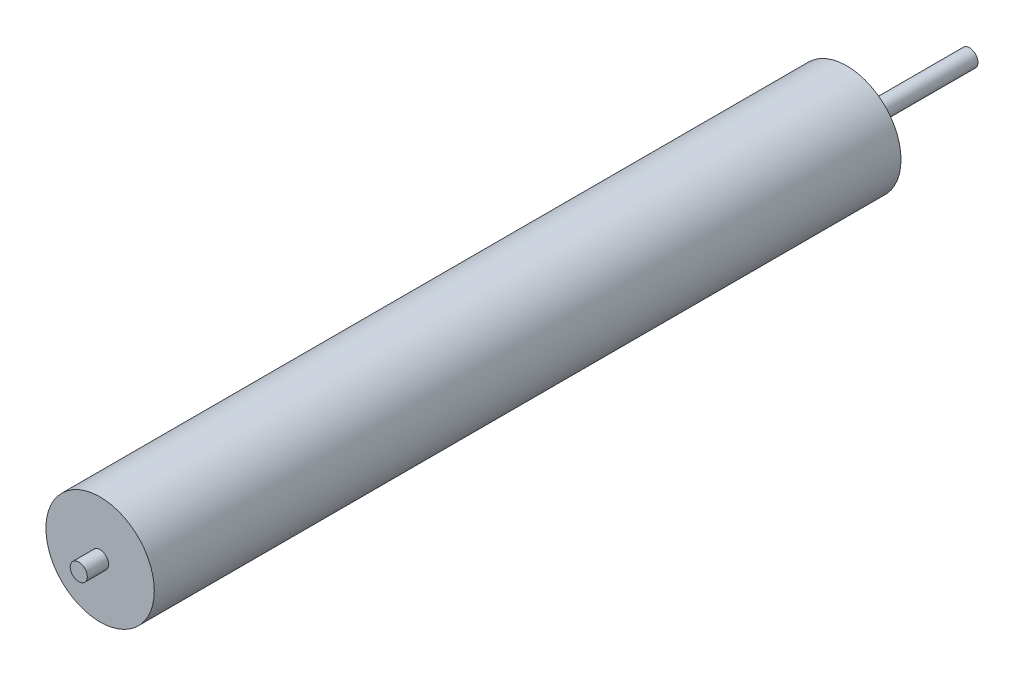
ISO-10303-21;
HEADER;
FILE_DESCRIPTION(('STEP AP214'),'2;1');
FILE_NAME('part.step','',(''),(''),'','','');
FILE_SCHEMA(('AUTOMOTIVE_DESIGN { 1 0 10303 214 1 1 1 1 }'));
ENDSEC;
DATA;
#1=APPLICATION_CONTEXT('core data for automotive mechanical design processes');
#2=APPLICATION_PROTOCOL_DEFINITION('international standard','automotive_design',2000,#1);
#3=PRODUCT_CONTEXT('',#1,'mechanical');
#4=PRODUCT('Part','Part','',(#3));
#5=PRODUCT_RELATED_PRODUCT_CATEGORY('part','',(#4));
#6=PRODUCT_DEFINITION_FORMATION('','',#4);
#7=PRODUCT_DEFINITION_CONTEXT('part definition',#1,'design');
#8=PRODUCT_DEFINITION('design','',#6,#7);
#9=PRODUCT_DEFINITION_SHAPE('','',#8);
#10=(LENGTH_UNIT() NAMED_UNIT(*) SI_UNIT(.MILLI.,.METRE.));
#11=(NAMED_UNIT(*) PLANE_ANGLE_UNIT() SI_UNIT($,.RADIAN.));
#12=(NAMED_UNIT(*) SI_UNIT($,.STERADIAN.) SOLID_ANGLE_UNIT());
#13=UNCERTAINTY_MEASURE_WITH_UNIT(LENGTH_MEASURE(1.E-05),#10,'distance_accuracy_value','');
#14=(GEOMETRIC_REPRESENTATION_CONTEXT(3) GLOBAL_UNCERTAINTY_ASSIGNED_CONTEXT((#13)) GLOBAL_UNIT_ASSIGNED_CONTEXT((#10,
#11,#12)) REPRESENTATION_CONTEXT('',''));
#15=CARTESIAN_POINT('',(0.,0.,0.));
#16=DIRECTION('',(0.,0.,1.));
#17=DIRECTION('',(1.,0.,0.));
#18=AXIS2_PLACEMENT_3D('',#15,#16,#17);
#19=CARTESIAN_POINT('',(0.,0.,350.));
#20=DIRECTION('',(0.,0.,-1.));
#21=DIRECTION('',(-1.,0.,0.));
#22=AXIS2_PLACEMENT_3D('',#19,#20,#21);
#23=CYLINDRICAL_SURFACE('',#22,50.8);
#24=CARTESIAN_POINT('',(0.,0.,350.));
#25=DIRECTION('',(0.,0.,1.));
#26=DIRECTION('',(1.,0.,0.));
#27=AXIS2_PLACEMENT_3D('',#24,#25,#26);
#28=CIRCLE('',#27,50.8);
#29=CARTESIAN_POINT('',(50.8,0.,350.));
#30=VERTEX_POINT('',#29);
#31=EDGE_CURVE('E37',#30,#30,#28,.T.);
#32=ORIENTED_EDGE('',*,*,#31,.F.);
#33=EDGE_LOOP('',(#32));
#34=FACE_BOUND('',#33,.T.);
#35=CARTESIAN_POINT('',(0.,0.,-350.));
#36=DIRECTION('',(0.,0.,1.));
#37=DIRECTION('',(1.,0.,0.));
#38=AXIS2_PLACEMENT_3D('',#35,#36,#37);
#39=CIRCLE('',#38,50.8);
#40=CARTESIAN_POINT('',(50.8,0.,-350.));
#41=VERTEX_POINT('',#40);
#42=EDGE_CURVE('E41',#41,#41,#39,.T.);
#43=ORIENTED_EDGE('',*,*,#42,.T.);
#44=EDGE_LOOP('',(#43));
#45=FACE_BOUND('',#44,.T.);
#46=ADVANCED_FACE('F31',(#34,#45),#23,.T.);
#47=CARTESIAN_POINT('',(0.,0.,350.));
#48=DIRECTION('',(0.,0.,1.));
#49=DIRECTION('',(1.,0.,0.));
#50=AXIS2_PLACEMENT_3D('',#47,#48,#49);
#51=PLANE('',#50);
#52=CARTESIAN_POINT('',(0.,0.,350.));
#53=DIRECTION('',(0.,0.,1.));
#54=DIRECTION('',(1.,0.,0.));
#55=AXIS2_PLACEMENT_3D('',#52,#53,#54);
#56=CIRCLE('',#55,8.);
#57=CARTESIAN_POINT('',(8.,0.,350.));
#58=VERTEX_POINT('',#57);
#59=EDGE_CURVE('E46',#58,#58,#56,.F.);
#60=ORIENTED_EDGE('',*,*,#59,.T.);
#61=EDGE_LOOP('',(#60));
#62=FACE_BOUND('',#61,.T.);
#63=ORIENTED_EDGE('',*,*,#31,.T.);
#64=EDGE_LOOP('',(#63));
#65=FACE_BOUND('',#64,.T.);
#66=ADVANCED_FACE('F70',(#62,#65),#51,.T.);
#67=CARTESIAN_POINT('',(0.,0.,-350.));
#68=DIRECTION('',(0.,0.,1.));
#69=DIRECTION('',(1.,0.,0.));
#70=AXIS2_PLACEMENT_3D('',#67,#68,#69);
#71=PLANE('',#70);
#72=CARTESIAN_POINT('',(0.,0.,-350.));
#73=DIRECTION('',(0.,0.,1.));
#74=DIRECTION('',(1.,0.,0.));
#75=AXIS2_PLACEMENT_3D('',#72,#73,#74);
#76=CIRCLE('',#75,8.);
#77=CARTESIAN_POINT('',(8.,0.,-350.));
#78=VERTEX_POINT('',#77);
#79=EDGE_CURVE('E10',#78,#78,#76,.F.);
#80=ORIENTED_EDGE('',*,*,#79,.F.);
#81=EDGE_LOOP('',(#80));
#82=FACE_BOUND('',#81,.T.);
#83=ORIENTED_EDGE('',*,*,#42,.F.);
#84=EDGE_LOOP('',(#83));
#85=FACE_BOUND('',#84,.T.);
#86=ADVANCED_FACE('F62',(#82,#85),#71,.F.);
#87=CARTESIAN_POINT('',(0.,0.,370.));
#88=DIRECTION('',(0.,0.,-1.));
#89=DIRECTION('',(-1.,0.,0.));
#90=AXIS2_PLACEMENT_3D('',#87,#88,#89);
#91=CYLINDRICAL_SURFACE('',#90,8.);
#92=ORIENTED_EDGE('',*,*,#79,.T.);
#93=EDGE_LOOP('',(#92));
#94=FACE_BOUND('',#93,.T.);
#95=CARTESIAN_POINT('',(0.,0.,-465.));
#96=DIRECTION('',(0.,0.,-1.));
#97=DIRECTION('',(-1.,0.,0.));
#98=AXIS2_PLACEMENT_3D('',#95,#96,#97);
#99=CIRCLE('',#98,8.);
#100=CARTESIAN_POINT('',(-8.,0.,-465.));
#101=VERTEX_POINT('',#100);
#102=EDGE_CURVE('E53',#101,#101,#99,.T.);
#103=ORIENTED_EDGE('',*,*,#102,.F.);
#104=EDGE_LOOP('',(#103));
#105=FACE_BOUND('',#104,.T.);
#106=ADVANCED_FACE('F59',(#94,#105),#91,.T.);
#107=ORIENTED_EDGE('',*,*,#59,.F.);
#108=EDGE_LOOP('',(#107));
#109=FACE_BOUND('',#108,.T.);
#110=CARTESIAN_POINT('',(0.,0.,370.));
#111=DIRECTION('',(0.,0.,1.));
#112=DIRECTION('',(1.,0.,0.));
#113=AXIS2_PLACEMENT_3D('',#110,#111,#112);
#114=CIRCLE('',#113,8.);
#115=CARTESIAN_POINT('',(8.,0.,370.));
#116=VERTEX_POINT('',#115);
#117=EDGE_CURVE('E50',#116,#116,#114,.T.);
#118=ORIENTED_EDGE('',*,*,#117,.F.);
#119=EDGE_LOOP('',(#118));
#120=FACE_BOUND('',#119,.T.);
#121=ADVANCED_FACE('F61',(#109,#120),#91,.T.);
#122=CARTESIAN_POINT('',(0.,0.,370.));
#123=DIRECTION('',(0.,0.,1.));
#124=DIRECTION('',(1.,0.,0.));
#125=AXIS2_PLACEMENT_3D('',#122,#123,#124);
#126=PLANE('',#125);
#127=ORIENTED_EDGE('',*,*,#117,.T.);
#128=EDGE_LOOP('',(#127));
#129=FACE_BOUND('',#128,.T.);
#130=ADVANCED_FACE('F68',(#129),#126,.T.);
#131=CARTESIAN_POINT('',(0.,0.,-465.));
#132=DIRECTION('',(0.,0.,-1.));
#133=DIRECTION('',(-1.,0.,0.));
#134=AXIS2_PLACEMENT_3D('',#131,#132,#133);
#135=PLANE('',#134);
#136=ORIENTED_EDGE('',*,*,#102,.T.);
#137=EDGE_LOOP('',(#136));
#138=FACE_BOUND('',#137,.T.);
#139=ADVANCED_FACE('F57',(#138),#135,.T.);
#140=CLOSED_SHELL('',(#46,#66,#86,#106,#121,#130,#139));
#141=MANIFOLD_SOLID_BREP('B2',#140);
#142=ADVANCED_BREP_SHAPE_REPRESENTATION('',(#18,#141),#14);
#143=SHAPE_DEFINITION_REPRESENTATION(#9,#142);
ENDSEC;
END-ISO-10303-21;
